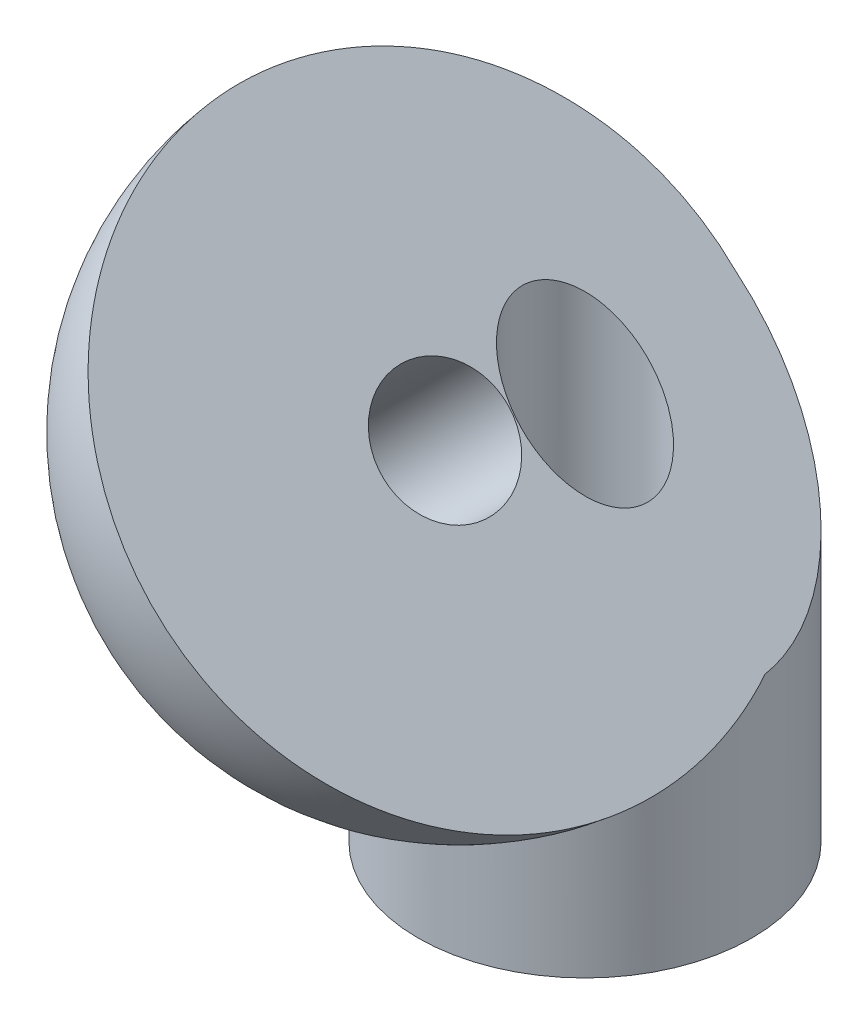
ISO-10303-21;
HEADER;
FILE_DESCRIPTION(('STEP AP214'),'2;1');
FILE_NAME('part.step','',(''),(''),'','','');
FILE_SCHEMA(('AUTOMOTIVE_DESIGN { 1 0 10303 214 1 1 1 1 }'));
ENDSEC;
DATA;
#1=APPLICATION_CONTEXT('core data for automotive mechanical design processes');
#2=APPLICATION_PROTOCOL_DEFINITION('international standard','automotive_design',2000,#1);
#3=PRODUCT_CONTEXT('',#1,'mechanical');
#4=PRODUCT('Part','Part','',(#3));
#5=PRODUCT_RELATED_PRODUCT_CATEGORY('part','',(#4));
#6=PRODUCT_DEFINITION_FORMATION('','',#4);
#7=PRODUCT_DEFINITION_CONTEXT('part definition',#1,'design');
#8=PRODUCT_DEFINITION('design','',#6,#7);
#9=PRODUCT_DEFINITION_SHAPE('','',#8);
#10=(LENGTH_UNIT() NAMED_UNIT(*) SI_UNIT(.MILLI.,.METRE.));
#11=(NAMED_UNIT(*) PLANE_ANGLE_UNIT() SI_UNIT($,.RADIAN.));
#12=(NAMED_UNIT(*) SI_UNIT($,.STERADIAN.) SOLID_ANGLE_UNIT());
#13=UNCERTAINTY_MEASURE_WITH_UNIT(LENGTH_MEASURE(1.E-05),#10,'distance_accuracy_value','');
#14=(GEOMETRIC_REPRESENTATION_CONTEXT(3) GLOBAL_UNCERTAINTY_ASSIGNED_CONTEXT((#13)) GLOBAL_UNIT_ASSIGNED_CONTEXT((#10,
#11,#12)) REPRESENTATION_CONTEXT('',''));
#15=CARTESIAN_POINT('',(0.,0.,0.));
#16=DIRECTION('',(0.,0.,1.));
#17=DIRECTION('',(1.,0.,0.));
#18=AXIS2_PLACEMENT_3D('',#15,#16,#17);
#19=CARTESIAN_POINT('',(0.,10.,3.));
#20=DIRECTION('',(0.,-1.,0.));
#21=DIRECTION('',(0.,0.,1.));
#22=AXIS2_PLACEMENT_3D('',#19,#20,#21);
#23=SPHERICAL_SURFACE('',#22,7.);
#24=CARTESIAN_POINT('',(-4.83476990145342,5.16523009854656,3.));
#25=DIRECTION('',(0.707106781186546,0.707106781186549,0.));
#26=DIRECTION('',(-0.707106781186549,0.707106781186546,0.));
#27=AXIS2_PLACEMENT_3D('',#24,#25,#26);
#28=CIRCLE('',#27,1.5);
#29=CARTESIAN_POINT('',(-5.89543007323324,6.22589027032638,3.));
#30=VERTEX_POINT('',#29);
#31=EDGE_CURVE('E55',#30,#30,#28,.F.);
#32=ORIENTED_EDGE('',*,*,#31,.F.);
#33=EDGE_LOOP('',(#32));
#34=FACE_BOUND('',#33,.T.);
#35=CARTESIAN_POINT('',(-0.353553390593285,9.64644660940671,3.));
#36=DIRECTION('',(-0.707106781186546,-0.707106781186549,0.));
#37=DIRECTION('',(0.707106781186549,-0.707106781186546,0.));
#38=AXIS2_PLACEMENT_3D('',#35,#36,#37);
#39=CIRCLE('',#38,6.98212002188447);
#40=CARTESIAN_POINT('',(-0.378739623783379,9.67163284259681,-3.98202916832316));
#41=VERTEX_POINT('',#40);
#42=CARTESIAN_POINT('',(3.98650128292883,5.30639193588761,-0.328340556749859));
#43=VERTEX_POINT('',#42);
#44=EDGE_CURVE('E51',#41,#43,#39,.F.);
#45=ORIENTED_EDGE('',*,*,#44,.F.);
#46=CARTESIAN_POINT('',(0.,10.,-4.));
#47=CARTESIAN_POINT('',(0.000330138331396565,9.99999998648906,-3.99999999999999));
#48=CARTESIAN_POINT('',(0.00066027666157775,9.99951913378673,-3.99999995912861));
#49=CARTESIAN_POINT('',(0.00145948608983426,9.9986068203159,-3.99999976124155));
#50=CARTESIAN_POINT('',(0.00192855728139046,9.99828130374799,-3.99999956258699));
#51=CARTESIAN_POINT('',(0.00353854628401459,9.99705352455883,-3.99999859755744));
#52=CARTESIAN_POINT('',(0.00467945946332891,9.99599297974753,-3.99999742557298));
#53=CARTESIAN_POINT('',(0.00874888071769983,9.99230631270703,-3.99999150432531));
#54=CARTESIAN_POINT('',(0.0116774018344976,9.98983074104902,-3.99998402724246));
#55=CARTESIAN_POINT('',(0.0813674151210854,9.93081745675017,-3.99972954322064));
#56=CARTESIAN_POINT('',(0.148129676382894,9.87205343186551,-3.99781393377423));
#57=CARTESIAN_POINT('',(0.280419871173962,9.75668397217121,-3.99069947106174));
#58=CARTESIAN_POINT('',(0.345950417101769,9.70005902961993,-3.98555380893002));
#59=CARTESIAN_POINT('',(0.480214472742212,9.58350789470872,-3.97167334130989));
#60=CARTESIAN_POINT('',(0.548931708386606,9.52356720933531,-3.96276119073213));
#61=CARTESIAN_POINT('',(0.686168826322692,9.40358363680451,-3.94132172647273));
#62=CARTESIAN_POINT('',(0.754686529098983,9.34354145024145,-3.92877876347756));
#63=CARTESIAN_POINT('',(0.882081073867156,9.23141991241256,-3.90199871073445));
#64=CARTESIAN_POINT('',(0.941040409831144,9.1793321369152,-3.8882015651312));
#65=CARTESIAN_POINT('',(1.05827470696457,9.07530886297598,-3.85794193129064));
#66=CARTESIAN_POINT('',(1.116550370072,9.02337325873106,-3.84148249150521));
#67=CARTESIAN_POINT('',(1.28900870598375,8.86886618878857,-3.78851037920438));
#68=CARTESIAN_POINT('',(1.402148165865,8.76643134450855,-3.74812476604042));
#69=CARTESIAN_POINT('',(1.64892875780733,8.5398796925302,-3.64725293977229));
#70=CARTESIAN_POINT('',(1.78168331942223,8.41588767257508,-3.58430591577299));
#71=CARTESIAN_POINT('',(2.04063803266867,8.16848694733743,-3.44348603895591));
#72=CARTESIAN_POINT('',(2.16681349038931,8.0450818272602,-3.36556147066333));
#73=CARTESIAN_POINT('',(2.41502215815068,7.79504731429271,-3.19239640746524));
#74=CARTESIAN_POINT('',(2.53673458991996,7.66846528776702,-3.09662640201844));
#75=CARTESIAN_POINT('',(2.76907185537741,7.41709253364804,-2.89072843868529));
#76=CARTESIAN_POINT('',(2.87970698122344,7.29230023732061,-2.78061403158777));
#77=CARTESIAN_POINT('',(3.08301658301639,7.05099578384609,-2.55286424332569));
#78=CARTESIAN_POINT('',(3.17631712086051,6.93438449953016,-2.43589278981473));
#79=CARTESIAN_POINT('',(3.35007276854259,6.7032454342751,-2.19079447243538));
#80=CARTESIAN_POINT('',(3.43052530237773,6.58871807522777,-2.06266537941723));
#81=CARTESIAN_POINT('',(3.57645610081004,6.36316595711225,-1.79767315391019));
#82=CARTESIAN_POINT('',(3.64206656466359,6.25211853984079,-1.66090224483623));
#83=CARTESIAN_POINT('',(3.75790998090388,6.03280058808347,-1.37889168355501));
#84=CARTESIAN_POINT('',(3.80814529591417,5.92452962929799,-1.23365333658483));
#85=CARTESIAN_POINT('',(3.88865794937078,5.71958024548912,-0.947944218433464));
#86=CARTESIAN_POINT('',(3.92019723951924,5.62266117569122,-0.808001413774204));
#87=CARTESIAN_POINT('',(3.968212522599,5.43186214050216,-0.523535828093745));
#88=CARTESIAN_POINT('',(3.98469037551853,5.33798180122938,-0.379013614880683));
#89=CARTESIAN_POINT('',(4.00174628990452,5.15348486542428,-0.0866358745341716));
#90=CARTESIAN_POINT('',(4.00229878214694,5.06287375073817,0.0612246316443081));
#91=CARTESIAN_POINT('',(3.98668986793358,4.88550222434104,0.358370829705861));
#92=CARTESIAN_POINT('',(3.97053089622949,4.79874125360947,0.507656310840197));
#93=CARTESIAN_POINT('',(3.9237716015209,4.63928849086952,0.788603792591468));
#94=CARTESIAN_POINT('',(3.89505056343041,4.56612772760184,0.920313740706756));
#95=CARTESIAN_POINT('',(3.82377844446811,4.42352993361101,1.18198946036007));
#96=CARTESIAN_POINT('',(3.78122981365818,4.35409224574675,1.31195553664365));
#97=CARTESIAN_POINT('',(3.68220598160119,4.21937376477173,1.56851771415899));
#98=CARTESIAN_POINT('',(3.62574547684399,4.15408867584124,1.69511721647206));
#99=CARTESIAN_POINT('',(3.49890178652924,4.02799332451796,1.94348160380285));
#100=CARTESIAN_POINT('',(3.42852071578639,3.96718238433468,2.06524721981565));
#101=CARTESIAN_POINT('',(3.28390323954709,3.85787327999991,2.28718735226997));
#102=CARTESIAN_POINT('',(3.21129533846627,3.80879274794525,2.38813838809046));
#103=CARTESIAN_POINT('',(3.05596184678892,3.71463525478217,2.5839323450908));
#104=CARTESIAN_POINT('',(2.97323791647856,3.6695576387887,2.67877626470654));
#105=CARTESIAN_POINT('',(2.79816682134981,3.58370834113832,2.86115941684503));
#106=CARTESIAN_POINT('',(2.70582488074604,3.54293434586735,2.94870256887155));
#107=CARTESIAN_POINT('',(2.51210084015416,3.46594780482753,3.11539267877119));
#108=CARTESIAN_POINT('',(2.41071979360748,3.42973472870073,3.19454061269732));
#109=CARTESIAN_POINT('',(2.21196708531352,3.36606485990606,3.33470048286782));
#110=CARTESIAN_POINT('',(2.11549537046466,3.33807960608329,3.39675117021069));
#111=CARTESIAN_POINT('',(1.91677622213181,3.28605971896674,3.51271956237983));
#112=CARTESIAN_POINT('',(1.81452950648509,3.26202459611423,3.56663827497252));
#113=CARTESIAN_POINT('',(1.60506826043351,3.2180731919182,3.66567471013609));
#114=CARTESIAN_POINT('',(1.49785604538633,3.19815501409217,3.71079648449552));
#115=CARTESIAN_POINT('',(1.27928292446966,3.1625636882097,3.79170304182619));
#116=CARTESIAN_POINT('',(1.1679222709164,3.1468902824558,3.82748839160109));
#117=CARTESIAN_POINT('',(0.951494277467443,3.12103603726493,3.88666545958683));
#118=CARTESIAN_POINT('',(0.846683562955482,3.11050452835088,3.91084548578338));
#119=CARTESIAN_POINT('',(0.635117489475298,3.09316165224119,3.95072341877887));
#120=CARTESIAN_POINT('',(0.528361506219939,3.08635150185486,3.96641855117049));
#121=CARTESIAN_POINT('',(0.313825710930436,3.07650434053498,3.98912798536997));
#122=CARTESIAN_POINT('',(0.206046582500824,3.07346496751203,3.99614772160665));
#123=CARTESIAN_POINT('',(-0.00980734710183429,3.07117097089801,4.00144505143774));
#124=CARTESIAN_POINT('',(-0.117882241238933,3.07191771872991,3.99971947727289));
#125=CARTESIAN_POINT('',(-0.329093785018867,3.07708750131357,3.98778521948125));
#126=CARTESIAN_POINT('',(-0.432253801673762,3.08136104929676,3.97792148368545));
#127=CARTESIAN_POINT('',(-0.637337285330424,3.09336816967419,3.95025453023694));
#128=CARTESIAN_POINT('',(-0.739260301563215,3.10110296665289,3.93244850262106));
#129=CARTESIAN_POINT('',(-0.941076025016767,3.11998321241462,3.88909033776037));
#130=CARTESIAN_POINT('',(-1.04096957779007,3.13112720837285,3.86354150014524));
#131=CARTESIAN_POINT('',(-1.23812939852057,3.15676661752626,3.80494647722097));
#132=CARTESIAN_POINT('',(-1.33539466966056,3.17126328288962,3.7718974908133));
#133=CARTESIAN_POINT('',(-1.5271324434676,3.20361113543301,3.69843976827709));
#134=CARTESIAN_POINT('',(-1.62158763901248,3.22147950423331,3.65799337019266));
#135=CARTESIAN_POINT('',(-1.80659033813581,3.26042158736632,3.57025647118114));
#136=CARTESIAN_POINT('',(-1.89713642049629,3.28149645508026,3.52296350783496));
#137=CARTESIAN_POINT('',(-2.162029839185,3.34936402863269,3.37148430495468));
#138=CARTESIAN_POINT('',(-2.32980028965721,3.40082805216361,3.25763272443599));
#139=CARTESIAN_POINT('',(-2.65116746590255,3.51779753320055,3.00256312434838));
#140=CARTESIAN_POINT('',(-2.8037461311376,3.58384346291905,2.86032087385583));
#141=CARTESIAN_POINT('',(-3.08277866114425,3.72720591000866,2.55713479062097));
#142=CARTESIAN_POINT('',(-3.20922459593062,3.80452583637386,2.3961853042429));
#143=CARTESIAN_POINT('',(-3.44321597225263,3.97570147076549,2.04738167899188));
#144=CARTESIAN_POINT('',(-3.54848387099552,4.07038042334957,1.8584067407693));
#145=CARTESIAN_POINT('',(-3.72595210765278,4.2699191860367,1.47064435900616));
#146=CARTESIAN_POINT('',(-3.79814372792034,4.37478167131523,1.2718543438607));
#147=CARTESIAN_POINT('',(-3.91543808798299,4.60437180577279,0.849723910712609));
#148=CARTESIAN_POINT('',(-3.95707117367147,4.73003622074775,0.62593073006601));
#149=CARTESIAN_POINT('',(-4.00225880655296,4.99048136338811,0.179715829002652));
#150=CARTESIAN_POINT('',(-4.00577979143683,5.12527002097971,-0.0427045102540011));
#151=CARTESIAN_POINT('',(-3.97548258532913,5.41815140037212,-0.505075935584369));
#152=CARTESIAN_POINT('',(-3.93739781577928,5.57715593430901,-0.744165942220637));
#153=CARTESIAN_POINT('',(-3.82117760913826,5.90264313999753,-1.20634875036623));
#154=CARTESIAN_POINT('',(-3.74310841974954,6.06911302789728,-1.42946731921025));
#155=CARTESIAN_POINT('',(-3.59444376484172,6.33252200609377,-1.75974232634568));
#156=CARTESIAN_POINT('',(-3.53603103374125,6.42737506585515,-1.87425364741716));
#157=CARTESIAN_POINT('',(-3.40921277277699,6.61878160898659,-2.09608493707151));
#158=CARTESIAN_POINT('',(-3.34080935566911,6.71533472905332,-2.20340641912581));
#159=CARTESIAN_POINT('',(-3.19417124211341,6.91085518794574,-2.41113907474484));
#160=CARTESIAN_POINT('',(-3.11584999488898,7.00983670163231,-2.51147561942709));
#161=CARTESIAN_POINT('',(-2.95079396468096,7.20912072556132,-2.70348661202061));
#162=CARTESIAN_POINT('',(-2.86406062357883,7.30942300687833,-2.79516253911261));
#163=CARTESIAN_POINT('',(-2.67283326817574,7.52259432331038,-2.97917784930529));
#164=CARTESIAN_POINT('',(-2.56743972270153,7.63560304364373,-3.07042239104991));
#165=CARTESIAN_POINT('',(-2.34846808964201,7.86293902122069,-3.24098398156939));
#166=CARTESIAN_POINT('',(-2.23488234396531,7.97726742602714,-3.32028965037918));
#167=CARTESIAN_POINT('',(-2.00491899735017,8.20295088151657,-3.4638173136237));
#168=CARTESIAN_POINT('',(-1.88877399818886,8.31427193006931,-3.52846628258238));
#169=CARTESIAN_POINT('',(-1.65163937544986,8.53728854429868,-3.64547777574682));
#170=CARTESIAN_POINT('',(-1.53066767481175,8.64898152790803,-3.69788155470762));
#171=CARTESIAN_POINT('',(-1.30350439645808,8.85576718638591,-3.78328646195868));
#172=CARTESIAN_POINT('',(-1.19789193281271,8.95077825039162,-3.81803077429605));
#173=CARTESIAN_POINT('',(-1.03720120337203,9.09404702098558,-3.86359432147704));
#174=CARTESIAN_POINT('',(-0.982952937406125,9.14219668398649,-3.87774968751925));
#175=CARTESIAN_POINT('',(-0.87390406300808,9.23862513995732,-3.90377214840614));
#176=CARTESIAN_POINT('',(-0.819102898375201,9.28690401742391,-3.91563663228137));
#177=CARTESIAN_POINT('',(-0.700764360340784,9.39081776631895,-3.93866636740379));
#178=CARTESIAN_POINT('',(-0.63716129954952,9.44645892665377,-3.94945334745676));
#179=CARTESIAN_POINT('',(-0.509833866513055,9.55763839986092,-3.96789483035349));
#180=CARTESIAN_POINT('',(-0.446111230878624,9.61317610421019,-3.97556277955553));
#181=CARTESIAN_POINT('',(-0.321640699306219,9.72116725235812,-3.9875124760662));
#182=CARTESIAN_POINT('',(-0.260905754148768,9.77363432973786,-3.99194617223633));
#183=CARTESIAN_POINT('',(-0.138317176508461,9.88052580257184,-3.99808649520697));
#184=CARTESIAN_POINT('',(-0.0764614561240301,9.93496816519984,-3.9997474593592));
#185=CARTESIAN_POINT('',(-0.0116776742164898,9.98983068281964,-3.9999840261882));
#186=CARTESIAN_POINT('',(-0.00874942442193631,9.99230587246482,-3.99999150292764));
#187=CARTESIAN_POINT('',(-0.00468010049123199,9.99599242405973,-3.99999742487598));
#188=CARTESIAN_POINT('',(-0.00353901309384161,9.99705314998769,-3.99999859719467));
#189=CARTESIAN_POINT('',(-0.00192878243107908,9.99828109697815,-3.99999956248613));
#190=CARTESIAN_POINT('',(-0.00145964378093833,9.9986066506246,-3.99999976119187));
#191=CARTESIAN_POINT('',(-0.000660336814325627,9.99951910022133,-3.9999999591212));
#192=CARTESIAN_POINT('',(-0.000330168406555012,10.0000000135122,-4.00000000000001));
#193=CARTESIAN_POINT('',(0.,10.,-4.));
#194=B_SPLINE_CURVE_WITH_KNOTS('',3,(#46,#47,#48,#49,#50,#51,#52,#53,#54,#55,#56,#57,#58,#59,
#60,#61,#62,#63,#64,#65,#66,#67,#68,#69,#70,#71,#72,#73,#74,#75,#76,#77,#78,#79,#80,#81,#82,#83,
#84,#85,#86,#87,#88,#89,#90,#91,#92,#93,#94,#95,#96,#97,#98,#99,#100,#101,#102,#103,#104,#105,
#106,#107,#108,#109,#110,#111,#112,#113,#114,#115,#116,#117,#118,#119,#120,#121,#122,#123,#124,
#125,#126,#127,#128,#129,#130,#131,#132,#133,#134,#135,#136,#137,#138,#139,#140,#141,#142,#143,
#144,#145,#146,#147,#148,#149,#150,#151,#152,#153,#154,#155,#156,#157,#158,#159,#160,#161,#162,
#163,#164,#165,#166,#167,#168,#169,#170,#171,#172,#173,#174,#175,#176,#177,#178,#179,#180,#181,
#182,#183,#184,#185,#186,#187,#188,#189,#190,#191,#192,#193),.UNSPECIFIED.,.T.,.F.,(4,2,2,2,2,2,
2,2,2,2,2,2,2,2,2,2,2,2,2,2,2,2,2,2,2,2,2,2,2,2,2,2,2,2,2,2,2,2,2,2,2,2,2,2,2,2,2,2,2,2,2,2,2,2,
2,2,2,2,2,2,2,2,2,2,2,2,2,2,2,2,2,2,2,4),(0.,0.00131019677505906,0.00317176537448638,
0.00769965544697064,0.0193218587762408,0.284273073240964,0.544971693553543,0.819622331046705,
1.09547484143038,1.33503780811835,1.57432838098331,2.0475648867475,2.62362278924476,
3.20170668518882,3.8009550367528,4.39964134419691,4.96798815321504,5.53644877211626,
6.09962705588437,6.66271875531333,7.18138285961259,7.69998290365573,8.21941554820546,
8.73877252545437,9.19826541671931,9.65767693642534,10.116605199494,10.5754637955824,
10.975969257188,11.3764090741171,11.7766325073611,12.176809358319,12.5305482202095,
12.8842432084284,13.2377749011215,13.5912851263135,13.9151146503124,14.2390499967817,
14.5627823211284,14.8866319173961,15.1974200072376,15.5083181404587,15.8190839690492,
16.1299660516597,16.4424773475746,16.7551013210738,17.3798087501382,18.0334857279211,
18.6873607738823,19.3928121100242,20.0984492694565,20.8753092179141,21.6528532298109,
22.518306451708,23.382330374365,23.8611830836443,24.3399346749447,24.8231966665717,
25.3063759702042,25.8441353052824,26.3824040229006,26.9020474668406,27.4199141130292,
27.8583462281174,28.0800247528955,28.3019544573167,28.5575075895591,28.8119470304446,
29.0534884581962,29.2989698229908,29.3105909478958,29.3151195293019,29.3169813656352,
29.3182916817674),.UNSPECIFIED.);
#195=EDGE_CURVE('E54',#43,#41,#194,.T.);
#196=ORIENTED_EDGE('',*,*,#195,.F.);
#197=EDGE_LOOP('',(#45,#196));
#198=FACE_BOUND('',#197,.T.);
#199=ADVANCED_FACE('F32',(#34,#198),#23,.T.);
#200=CARTESIAN_POINT('',(0.,10.,0.));
#201=DIRECTION('',(0.,-1.,0.));
#202=DIRECTION('',(0.,0.,-1.));
#203=AXIS2_PLACEMENT_3D('',#200,#201,#202);
#204=CYLINDRICAL_SURFACE('',#203,4.);
#205=CARTESIAN_POINT('',(0.,9.29289321881343,0.));
#206=DIRECTION('',(-0.707106781186546,-0.707106781186549,0.));
#207=DIRECTION('',(0.707106781186549,-0.707106781186546,0.));
#208=AXIS2_PLACEMENT_3D('',#205,#206,#207);
#209=ELLIPSE('',#208,5.65685424949237,4.);
#210=EDGE_CURVE('E11',#41,#43,#209,.T.);
#211=ORIENTED_EDGE('',*,*,#210,.T.);
#212=ORIENTED_EDGE('',*,*,#195,.T.);
#213=EDGE_LOOP('',(#211,#212));
#214=FACE_BOUND('',#213,.T.);
#215=CARTESIAN_POINT('',(0.,0.,0.));
#216=DIRECTION('',(0.,1.,0.));
#217=DIRECTION('',(0.,0.,1.));
#218=AXIS2_PLACEMENT_3D('',#215,#216,#217);
#219=CIRCLE('',#218,4.);
#220=CARTESIAN_POINT('',(0.,0.,4.));
#221=VERTEX_POINT('',#220);
#222=EDGE_CURVE('E42',#221,#221,#219,.T.);
#223=ORIENTED_EDGE('',*,*,#222,.T.);
#224=EDGE_LOOP('',(#223));
#225=FACE_BOUND('',#224,.T.);
#226=ADVANCED_FACE('F34',(#214,#225),#204,.T.);
#227=CARTESIAN_POINT('',(0.,0.,0.));
#228=DIRECTION('',(0.,1.,0.));
#229=DIRECTION('',(0.,0.,1.));
#230=AXIS2_PLACEMENT_3D('',#227,#228,#229);
#231=PLANE('',#230);
#232=CARTESIAN_POINT('',(0.,0.,0.));
#233=DIRECTION('',(0.,-1.,0.));
#234=DIRECTION('',(0.,0.,-1.));
#235=AXIS2_PLACEMENT_3D('',#232,#233,#234);
#236=CIRCLE('',#235,1.5);
#237=CARTESIAN_POINT('',(0.,0.,-1.5));
#238=VERTEX_POINT('',#237);
#239=EDGE_CURVE('E83',#238,#238,#236,.T.);
#240=ORIENTED_EDGE('',*,*,#239,.F.);
#241=EDGE_LOOP('',(#240));
#242=FACE_BOUND('',#241,.T.);
#243=ORIENTED_EDGE('',*,*,#222,.F.);
#244=EDGE_LOOP('',(#243));
#245=FACE_BOUND('',#244,.T.);
#246=ADVANCED_FACE('F71',(#242,#245),#231,.F.);
#247=CARTESIAN_POINT('',(-7.35355339059327,16.6464466094067,-4.));
#248=DIRECTION('',(-0.707106781186546,-0.707106781186549,0.));
#249=DIRECTION('',(0.707106781186549,-0.707106781186546,0.));
#250=AXIS2_PLACEMENT_3D('',#247,#248,#249);
#251=PLANE('',#250);
#252=CARTESIAN_POINT('',(0.,9.29289321881343,0.));
#253=DIRECTION('',(-0.707106781186546,-0.707106781186549,0.));
#254=DIRECTION('',(0.707106781186549,-0.707106781186546,0.));
#255=AXIS2_PLACEMENT_3D('',#252,#253,#254);
#256=ELLIPSE('',#255,2.12132034355964,1.5);
#257=CARTESIAN_POINT('',(1.5,7.79289321881344,0.));
#258=VERTEX_POINT('',#257);
#259=EDGE_CURVE('E37',#258,#258,#256,.T.);
#260=ORIENTED_EDGE('',*,*,#259,.T.);
#261=EDGE_LOOP('',(#260));
#262=FACE_BOUND('',#261,.T.);
#263=CARTESIAN_POINT('',(-0.353553390593281,9.64644660940672,3.));
#264=DIRECTION('',(0.707106781186546,0.707106781186549,0.));
#265=DIRECTION('',(-0.707106781186549,0.707106781186546,0.));
#266=AXIS2_PLACEMENT_3D('',#263,#264,#265);
#267=CIRCLE('',#266,1.5);
#268=CARTESIAN_POINT('',(-1.4142135623731,10.7071067811865,3.));
#269=VERTEX_POINT('',#268);
#270=EDGE_CURVE('E88',#269,#269,#267,.T.);
#271=ORIENTED_EDGE('',*,*,#270,.F.);
#272=EDGE_LOOP('',(#271));
#273=FACE_BOUND('',#272,.T.);
#274=ORIENTED_EDGE('',*,*,#44,.T.);
#275=ORIENTED_EDGE('',*,*,#210,.F.);
#276=EDGE_LOOP('',(#274,#275));
#277=FACE_BOUND('',#276,.T.);
#278=ADVANCED_FACE('F50',(#262,#273,#277),#251,.F.);
#279=CARTESIAN_POINT('',(-8.49999999999999,1.49999999999998,3.));
#280=DIRECTION('',(0.707106781186546,0.707106781186549,0.));
#281=DIRECTION('',(-0.707106781186549,0.707106781186546,0.));
#282=AXIS2_PLACEMENT_3D('',#279,#280,#281);
#283=CYLINDRICAL_SURFACE('',#282,1.5);
#284=ORIENTED_EDGE('',*,*,#31,.T.);
#285=EDGE_LOOP('',(#284));
#286=FACE_BOUND('',#285,.T.);
#287=ORIENTED_EDGE('',*,*,#270,.T.);
#288=EDGE_LOOP('',(#287));
#289=FACE_BOUND('',#288,.T.);
#290=ADVANCED_FACE('F78',(#286,#289),#283,.F.);
#291=CARTESIAN_POINT('',(0.,14.5835510239396,0.));
#292=DIRECTION('',(0.,-1.,0.));
#293=DIRECTION('',(0.,0.,-1.));
#294=AXIS2_PLACEMENT_3D('',#291,#292,#293);
#295=CYLINDRICAL_SURFACE('',#294,1.5);
#296=ORIENTED_EDGE('',*,*,#239,.T.);
#297=EDGE_LOOP('',(#296));
#298=FACE_BOUND('',#297,.T.);
#299=ORIENTED_EDGE('',*,*,#259,.F.);
#300=EDGE_LOOP('',(#299));
#301=FACE_BOUND('',#300,.T.);
#302=ADVANCED_FACE('F96',(#298,#301),#295,.F.);
#303=CLOSED_SHELL('',(#199,#226,#246,#278,#290,#302));
#304=MANIFOLD_SOLID_BREP('B2',#303);
#305=ADVANCED_BREP_SHAPE_REPRESENTATION('',(#18,#304),#14);
#306=SHAPE_DEFINITION_REPRESENTATION(#9,#305);
ENDSEC;
END-ISO-10303-21;
